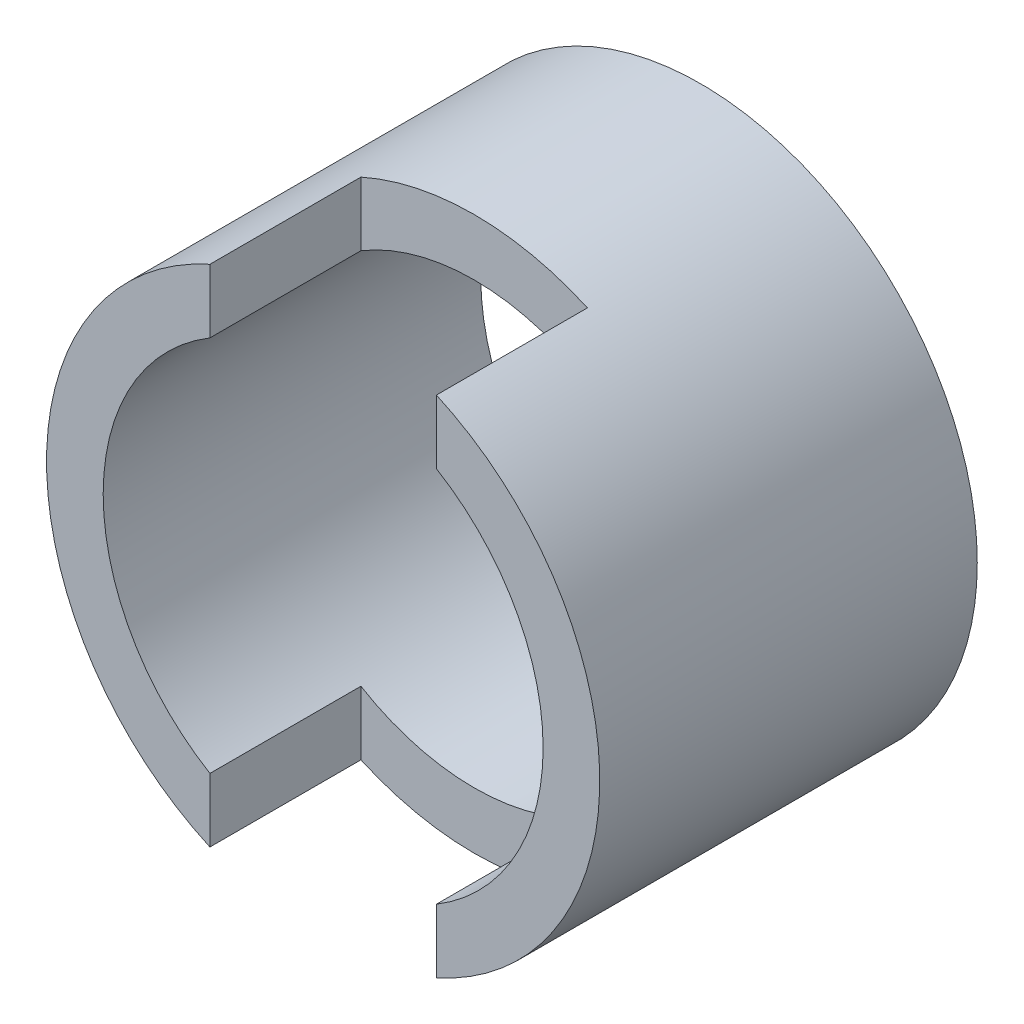
ISO-10303-21;
HEADER;
FILE_DESCRIPTION(('STEP AP214'),'2;1');
FILE_NAME('part.step','',(''),(''),'','','');
FILE_SCHEMA(('AUTOMOTIVE_DESIGN { 1 0 10303 214 1 1 1 1 }'));
ENDSEC;
DATA;
#1=APPLICATION_CONTEXT('core data for automotive mechanical design processes');
#2=APPLICATION_PROTOCOL_DEFINITION('international standard','automotive_design',2000,#1);
#3=PRODUCT_CONTEXT('',#1,'mechanical');
#4=PRODUCT('Part','Part','',(#3));
#5=PRODUCT_RELATED_PRODUCT_CATEGORY('part','',(#4));
#6=PRODUCT_DEFINITION_FORMATION('','',#4);
#7=PRODUCT_DEFINITION_CONTEXT('part definition',#1,'design');
#8=PRODUCT_DEFINITION('design','',#6,#7);
#9=PRODUCT_DEFINITION_SHAPE('','',#8);
#10=(LENGTH_UNIT() NAMED_UNIT(*) SI_UNIT(.MILLI.,.METRE.));
#11=(NAMED_UNIT(*) PLANE_ANGLE_UNIT() SI_UNIT($,.RADIAN.));
#12=(NAMED_UNIT(*) SI_UNIT($,.STERADIAN.) SOLID_ANGLE_UNIT());
#13=UNCERTAINTY_MEASURE_WITH_UNIT(LENGTH_MEASURE(1.E-05),#10,'distance_accuracy_value','');
#14=(GEOMETRIC_REPRESENTATION_CONTEXT(3) GLOBAL_UNCERTAINTY_ASSIGNED_CONTEXT((#13)) GLOBAL_UNIT_ASSIGNED_CONTEXT((#10,
#11,#12)) REPRESENTATION_CONTEXT('',''));
#15=CARTESIAN_POINT('',(0.,0.,0.));
#16=DIRECTION('',(0.,0.,1.));
#17=DIRECTION('',(1.,0.,0.));
#18=AXIS2_PLACEMENT_3D('',#15,#16,#17);
#19=CARTESIAN_POINT('',(0.,0.,31.75));
#20=DIRECTION('',(0.,0.,1.));
#21=DIRECTION('',(1.,0.,0.));
#22=AXIS2_PLACEMENT_3D('',#19,#20,#21);
#23=PLANE('',#22);
#24=DIRECTION('',(0.,1.,0.));
#25=VECTOR('',#24,1.);
#26=CARTESIAN_POINT('',(9.525,25.4,31.75));
#27=LINE('',#26,#25);
#28=CARTESIAN_POINT('',(9.525,-21.2230601292556,31.75));
#29=VERTEX_POINT('',#28);
#30=CARTESIAN_POINT('',(9.525,-15.8595200116523,31.75));
#31=VERTEX_POINT('',#30);
#32=EDGE_CURVE('E102',#29,#31,#27,.T.);
#33=ORIENTED_EDGE('',*,*,#32,.F.);
#34=CARTESIAN_POINT('',(0.,0.,31.75));
#35=DIRECTION('',(0.,0.,1.));
#36=DIRECTION('',(1.,0.,0.));
#37=AXIS2_PLACEMENT_3D('',#34,#35,#36);
#38=CIRCLE('',#37,23.2625);
#39=CARTESIAN_POINT('',(9.525,21.2230601292556,31.75));
#40=VERTEX_POINT('',#39);
#41=EDGE_CURVE('E114',#29,#40,#38,.T.);
#42=ORIENTED_EDGE('',*,*,#41,.T.);
#43=CARTESIAN_POINT('',(9.525,15.8595200116523,31.75));
#44=VERTEX_POINT('',#43);
#45=EDGE_CURVE('E118',#44,#40,#27,.T.);
#46=ORIENTED_EDGE('',*,*,#45,.F.);
#47=CARTESIAN_POINT('',(0.,0.,31.75));
#48=DIRECTION('',(0.,0.,1.));
#49=DIRECTION('',(1.,0.,0.));
#50=AXIS2_PLACEMENT_3D('',#47,#48,#49);
#51=CIRCLE('',#50,18.5);
#52=EDGE_CURVE('E116',#31,#44,#51,.T.);
#53=ORIENTED_EDGE('',*,*,#52,.F.);
#54=EDGE_LOOP('',(#33,#42,#46,#53));
#55=FACE_BOUND('',#54,.T.);
#56=ADVANCED_FACE('F36',(#55),#23,.T.);
#57=DIRECTION('',(0.,-1.,0.));
#58=VECTOR('',#57,1.);
#59=CARTESIAN_POINT('',(-9.525,25.4,31.75));
#60=LINE('',#59,#58);
#61=CARTESIAN_POINT('',(-9.525,21.2230601292556,31.75));
#62=VERTEX_POINT('',#61);
#63=CARTESIAN_POINT('',(-9.525,15.8595200116523,31.75));
#64=VERTEX_POINT('',#63);
#65=EDGE_CURVE('E155',#62,#64,#60,.T.);
#66=ORIENTED_EDGE('',*,*,#65,.F.);
#67=CARTESIAN_POINT('',(-9.525,-21.2230601292556,31.75));
#68=VERTEX_POINT('',#67);
#69=EDGE_CURVE('E123',#62,#68,#38,.T.);
#70=ORIENTED_EDGE('',*,*,#69,.T.);
#71=CARTESIAN_POINT('',(-9.525,-15.8595200116523,31.75));
#72=VERTEX_POINT('',#71);
#73=EDGE_CURVE('E117',#72,#68,#60,.T.);
#74=ORIENTED_EDGE('',*,*,#73,.F.);
#75=EDGE_CURVE('E129',#64,#72,#51,.T.);
#76=ORIENTED_EDGE('',*,*,#75,.F.);
#77=EDGE_LOOP('',(#66,#70,#74,#76));
#78=FACE_BOUND('',#77,.T.);
#79=ADVANCED_FACE('F187',(#78),#23,.T.);
#80=CARTESIAN_POINT('',(0.,0.,0.));
#81=DIRECTION('',(0.,0.,1.));
#82=DIRECTION('',(1.,0.,0.));
#83=AXIS2_PLACEMENT_3D('',#80,#81,#82);
#84=PLANE('',#83);
#85=CARTESIAN_POINT('',(0.,0.,0.));
#86=DIRECTION('',(0.,0.,1.));
#87=DIRECTION('',(1.,0.,0.));
#88=AXIS2_PLACEMENT_3D('',#85,#86,#87);
#89=CIRCLE('',#88,23.2625);
#90=CARTESIAN_POINT('',(23.2625,0.,0.));
#91=VERTEX_POINT('',#90);
#92=EDGE_CURVE('E124',#91,#91,#89,.T.);
#93=ORIENTED_EDGE('',*,*,#92,.F.);
#94=EDGE_LOOP('',(#93));
#95=FACE_BOUND('',#94,.T.);
#96=CARTESIAN_POINT('',(0.,0.,0.));
#97=DIRECTION('',(0.,0.,1.));
#98=DIRECTION('',(1.,0.,0.));
#99=AXIS2_PLACEMENT_3D('',#96,#97,#98);
#100=CIRCLE('',#99,18.5);
#101=CARTESIAN_POINT('',(18.5,0.,0.));
#102=VERTEX_POINT('',#101);
#103=EDGE_CURVE('E107',#102,#102,#100,.T.);
#104=ORIENTED_EDGE('',*,*,#103,.T.);
#105=EDGE_LOOP('',(#104));
#106=FACE_BOUND('',#105,.T.);
#107=ADVANCED_FACE('F174',(#95,#106),#84,.F.);
#108=CARTESIAN_POINT('',(0.,0.,31.75));
#109=DIRECTION('',(0.,0.,-1.));
#110=DIRECTION('',(-1.,0.,0.));
#111=AXIS2_PLACEMENT_3D('',#108,#109,#110);
#112=CYLINDRICAL_SURFACE('',#111,23.2625);
#113=CARTESIAN_POINT('',(0.,0.,19.05));
#114=DIRECTION('',(0.,0.,1.));
#115=DIRECTION('',(1.,0.,0.));
#116=AXIS2_PLACEMENT_3D('',#113,#114,#115);
#117=CIRCLE('',#116,23.2625);
#118=CARTESIAN_POINT('',(9.525,21.2230601292556,19.05));
#119=VERTEX_POINT('',#118);
#120=CARTESIAN_POINT('',(-9.525,21.2230601292556,19.05));
#121=VERTEX_POINT('',#120);
#122=EDGE_CURVE('E164',#119,#121,#117,.T.);
#123=ORIENTED_EDGE('',*,*,#122,.F.);
#124=DIRECTION('',(0.,0.,-1.));
#125=VECTOR('',#124,1.);
#126=CARTESIAN_POINT('',(9.525,21.2230601292556,31.75));
#127=LINE('',#126,#125);
#128=EDGE_CURVE('E108',#119,#40,#127,.F.);
#129=ORIENTED_EDGE('',*,*,#128,.T.);
#130=ORIENTED_EDGE('',*,*,#41,.F.);
#131=DIRECTION('',(0.,0.,-1.));
#132=VECTOR('',#131,1.);
#133=CARTESIAN_POINT('',(9.525,-21.2230601292556,31.75));
#134=LINE('',#133,#132);
#135=CARTESIAN_POINT('',(9.525,-21.2230601292556,19.05));
#136=VERTEX_POINT('',#135);
#137=EDGE_CURVE('E99',#29,#136,#134,.T.);
#138=ORIENTED_EDGE('',*,*,#137,.T.);
#139=CARTESIAN_POINT('',(-9.525,-21.2230601292556,19.05));
#140=VERTEX_POINT('',#139);
#141=EDGE_CURVE('E162',#140,#136,#117,.T.);
#142=ORIENTED_EDGE('',*,*,#141,.F.);
#143=DIRECTION('',(0.,0.,-1.));
#144=VECTOR('',#143,1.);
#145=CARTESIAN_POINT('',(-9.525,-21.2230601292556,31.75));
#146=LINE('',#145,#144);
#147=EDGE_CURVE('E165',#140,#68,#146,.F.);
#148=ORIENTED_EDGE('',*,*,#147,.T.);
#149=ORIENTED_EDGE('',*,*,#69,.F.);
#150=DIRECTION('',(0.,0.,-1.));
#151=VECTOR('',#150,1.);
#152=CARTESIAN_POINT('',(-9.525,21.2230601292556,31.75));
#153=LINE('',#152,#151);
#154=EDGE_CURVE('E168',#62,#121,#153,.T.);
#155=ORIENTED_EDGE('',*,*,#154,.T.);
#156=EDGE_LOOP('',(#123,#129,#130,#138,#142,#148,#149,#155));
#157=FACE_BOUND('',#156,.T.);
#158=ORIENTED_EDGE('',*,*,#92,.T.);
#159=EDGE_LOOP('',(#158));
#160=FACE_BOUND('',#159,.T.);
#161=ADVANCED_FACE('F38',(#157,#160),#112,.T.);
#162=CARTESIAN_POINT('',(0.,0.,31.75));
#163=DIRECTION('',(0.,0.,-1.));
#164=DIRECTION('',(-1.,0.,0.));
#165=AXIS2_PLACEMENT_3D('',#162,#163,#164);
#166=CYLINDRICAL_SURFACE('',#165,18.5);
#167=DIRECTION('',(0.,0.,-1.));
#168=VECTOR('',#167,1.);
#169=CARTESIAN_POINT('',(9.525,15.8595200116523,31.75));
#170=LINE('',#169,#168);
#171=CARTESIAN_POINT('',(9.525,15.8595200116523,19.05));
#172=VERTEX_POINT('',#171);
#173=EDGE_CURVE('E11',#172,#44,#170,.F.);
#174=ORIENTED_EDGE('',*,*,#173,.F.);
#175=CARTESIAN_POINT('',(0.,0.,19.05));
#176=DIRECTION('',(0.,0.,1.));
#177=DIRECTION('',(1.,0.,0.));
#178=AXIS2_PLACEMENT_3D('',#175,#176,#177);
#179=CIRCLE('',#178,18.5);
#180=CARTESIAN_POINT('',(-9.525,15.8595200116523,19.05));
#181=VERTEX_POINT('',#180);
#182=EDGE_CURVE('E137',#172,#181,#179,.T.);
#183=ORIENTED_EDGE('',*,*,#182,.T.);
#184=DIRECTION('',(0.,0.,-1.));
#185=VECTOR('',#184,1.);
#186=CARTESIAN_POINT('',(-9.525,15.8595200116523,31.75));
#187=LINE('',#186,#185);
#188=EDGE_CURVE('E44',#64,#181,#187,.T.);
#189=ORIENTED_EDGE('',*,*,#188,.F.);
#190=ORIENTED_EDGE('',*,*,#75,.T.);
#191=DIRECTION('',(0.,0.,-1.));
#192=VECTOR('',#191,1.);
#193=CARTESIAN_POINT('',(-9.525,-15.8595200116523,31.75));
#194=LINE('',#193,#192);
#195=CARTESIAN_POINT('',(-9.525,-15.8595200116523,19.05));
#196=VERTEX_POINT('',#195);
#197=EDGE_CURVE('E136',#196,#72,#194,.F.);
#198=ORIENTED_EDGE('',*,*,#197,.F.);
#199=CARTESIAN_POINT('',(9.525,-15.8595200116523,19.05));
#200=VERTEX_POINT('',#199);
#201=EDGE_CURVE('E127',#196,#200,#179,.T.);
#202=ORIENTED_EDGE('',*,*,#201,.T.);
#203=DIRECTION('',(0.,0.,-1.));
#204=VECTOR('',#203,1.);
#205=CARTESIAN_POINT('',(9.525,-15.8595200116523,31.75));
#206=LINE('',#205,#204);
#207=EDGE_CURVE('E139',#31,#200,#206,.T.);
#208=ORIENTED_EDGE('',*,*,#207,.F.);
#209=ORIENTED_EDGE('',*,*,#52,.T.);
#210=EDGE_LOOP('',(#174,#183,#189,#190,#198,#202,#208,#209));
#211=FACE_BOUND('',#210,.T.);
#212=ORIENTED_EDGE('',*,*,#103,.F.);
#213=EDGE_LOOP('',(#212));
#214=FACE_BOUND('',#213,.T.);
#215=ADVANCED_FACE('F145',(#211,#214),#166,.F.);
#216=CARTESIAN_POINT('',(0.,0.,19.05));
#217=DIRECTION('',(0.,0.,1.));
#218=DIRECTION('',(1.,0.,0.));
#219=AXIS2_PLACEMENT_3D('',#216,#217,#218);
#220=PLANE('',#219);
#221=ORIENTED_EDGE('',*,*,#141,.T.);
#222=DIRECTION('',(0.,1.,0.));
#223=VECTOR('',#222,1.);
#224=CARTESIAN_POINT('',(9.525,25.4,19.05));
#225=LINE('',#224,#223);
#226=EDGE_CURVE('E59',#136,#200,#225,.T.);
#227=ORIENTED_EDGE('',*,*,#226,.T.);
#228=ORIENTED_EDGE('',*,*,#201,.F.);
#229=DIRECTION('',(0.,-1.,0.));
#230=VECTOR('',#229,1.);
#231=CARTESIAN_POINT('',(-9.525,25.4,19.05));
#232=LINE('',#231,#230);
#233=EDGE_CURVE('E157',#196,#140,#232,.T.);
#234=ORIENTED_EDGE('',*,*,#233,.T.);
#235=EDGE_LOOP('',(#221,#227,#228,#234));
#236=FACE_BOUND('',#235,.T.);
#237=ADVANCED_FACE('F176',(#236),#220,.T.);
#238=CARTESIAN_POINT('',(-9.525,25.4,19.05));
#239=DIRECTION('',(-1.,0.,0.));
#240=DIRECTION('',(0.,-1.,0.));
#241=AXIS2_PLACEMENT_3D('',#238,#239,#240);
#242=PLANE('',#241);
#243=ORIENTED_EDGE('',*,*,#233,.F.);
#244=ORIENTED_EDGE('',*,*,#197,.T.);
#245=ORIENTED_EDGE('',*,*,#73,.T.);
#246=ORIENTED_EDGE('',*,*,#147,.F.);
#247=EDGE_LOOP('',(#243,#244,#245,#246));
#248=FACE_BOUND('',#247,.T.);
#249=ADVANCED_FACE('F182',(#248),#242,.F.);
#250=CARTESIAN_POINT('',(9.525,25.4,19.05));
#251=DIRECTION('',(1.,0.,0.));
#252=DIRECTION('',(0.,0.,-1.));
#253=AXIS2_PLACEMENT_3D('',#250,#251,#252);
#254=PLANE('',#253);
#255=ORIENTED_EDGE('',*,*,#32,.T.);
#256=ORIENTED_EDGE('',*,*,#207,.T.);
#257=ORIENTED_EDGE('',*,*,#226,.F.);
#258=ORIENTED_EDGE('',*,*,#137,.F.);
#259=EDGE_LOOP('',(#255,#256,#257,#258));
#260=FACE_BOUND('',#259,.T.);
#261=ADVANCED_FACE('F101',(#260),#254,.F.);
#262=EDGE_CURVE('E152',#172,#119,#225,.T.);
#263=ORIENTED_EDGE('',*,*,#262,.F.);
#264=ORIENTED_EDGE('',*,*,#173,.T.);
#265=ORIENTED_EDGE('',*,*,#45,.T.);
#266=ORIENTED_EDGE('',*,*,#128,.F.);
#267=EDGE_LOOP('',(#263,#264,#265,#266));
#268=FACE_BOUND('',#267,.T.);
#269=ADVANCED_FACE('F154',(#268),#254,.F.);
#270=ORIENTED_EDGE('',*,*,#65,.T.);
#271=ORIENTED_EDGE('',*,*,#188,.T.);
#272=EDGE_CURVE('E51',#121,#181,#232,.T.);
#273=ORIENTED_EDGE('',*,*,#272,.F.);
#274=ORIENTED_EDGE('',*,*,#154,.F.);
#275=EDGE_LOOP('',(#270,#271,#273,#274));
#276=FACE_BOUND('',#275,.T.);
#277=ADVANCED_FACE('F227',(#276),#242,.F.);
#278=ORIENTED_EDGE('',*,*,#122,.T.);
#279=ORIENTED_EDGE('',*,*,#272,.T.);
#280=ORIENTED_EDGE('',*,*,#182,.F.);
#281=ORIENTED_EDGE('',*,*,#262,.T.);
#282=EDGE_LOOP('',(#278,#279,#280,#281));
#283=FACE_BOUND('',#282,.T.);
#284=ADVANCED_FACE('F151',(#283),#220,.T.);
#285=CLOSED_SHELL('',(#56,#79,#107,#161,#215,#237,#249,#261,#269,#277,#284));
#286=MANIFOLD_SOLID_BREP('B2',#285);
#287=ADVANCED_BREP_SHAPE_REPRESENTATION('',(#18,#286),#14);
#288=SHAPE_DEFINITION_REPRESENTATION(#9,#287);
ENDSEC;
END-ISO-10303-21;
